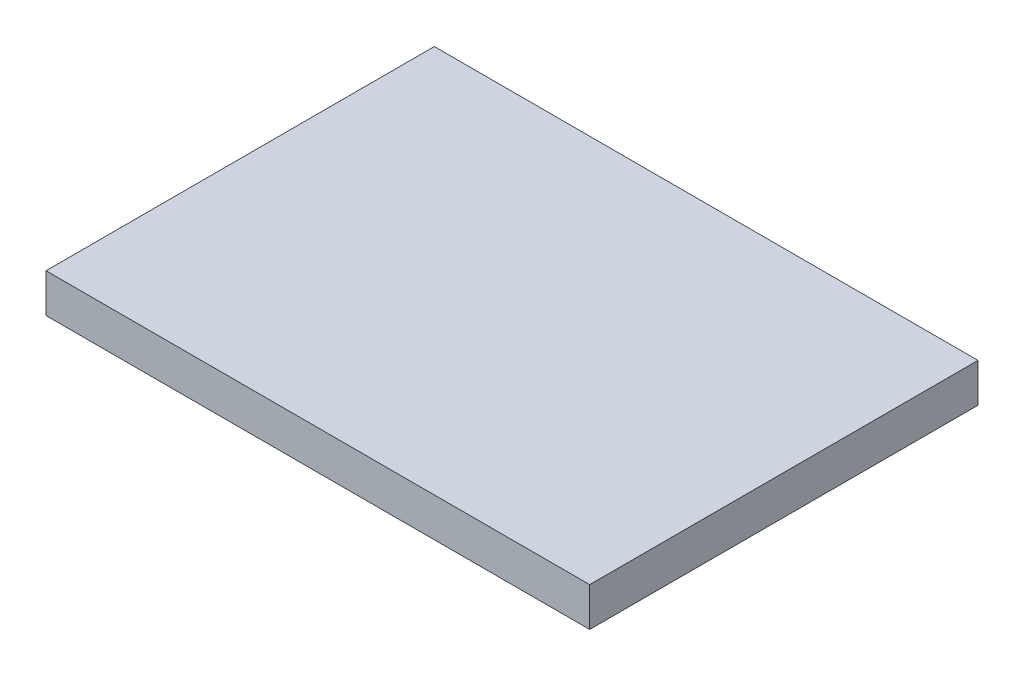
ISO-10303-21;
HEADER;
FILE_DESCRIPTION(('STEP AP214'),'2;1');
FILE_NAME('part.step','',(''),(''),'','','');
FILE_SCHEMA(('AUTOMOTIVE_DESIGN { 1 0 10303 214 1 1 1 1 }'));
ENDSEC;
DATA;
#1=APPLICATION_CONTEXT('core data for automotive mechanical design processes');
#2=APPLICATION_PROTOCOL_DEFINITION('international standard','automotive_design',2000,#1);
#3=PRODUCT_CONTEXT('',#1,'mechanical');
#4=PRODUCT('Part','Part','',(#3));
#5=PRODUCT_RELATED_PRODUCT_CATEGORY('part','',(#4));
#6=PRODUCT_DEFINITION_FORMATION('','',#4);
#7=PRODUCT_DEFINITION_CONTEXT('part definition',#1,'design');
#8=PRODUCT_DEFINITION('design','',#6,#7);
#9=PRODUCT_DEFINITION_SHAPE('','',#8);
#10=(LENGTH_UNIT() NAMED_UNIT(*) SI_UNIT(.MILLI.,.METRE.));
#11=(NAMED_UNIT(*) PLANE_ANGLE_UNIT() SI_UNIT($,.RADIAN.));
#12=(NAMED_UNIT(*) SI_UNIT($,.STERADIAN.) SOLID_ANGLE_UNIT());
#13=UNCERTAINTY_MEASURE_WITH_UNIT(LENGTH_MEASURE(1.E-05),#10,'distance_accuracy_value','');
#14=(GEOMETRIC_REPRESENTATION_CONTEXT(3) GLOBAL_UNCERTAINTY_ASSIGNED_CONTEXT((#13)) GLOBAL_UNIT_ASSIGNED_CONTEXT((#10,
#11,#12)) REPRESENTATION_CONTEXT('',''));
#15=CARTESIAN_POINT('',(0.,0.,0.));
#16=DIRECTION('',(0.,0.,1.));
#17=DIRECTION('',(1.,0.,0.));
#18=AXIS2_PLACEMENT_3D('',#15,#16,#17);
#19=CARTESIAN_POINT('',(88.9,12.7,-63.5));
#20=DIRECTION('',(-1.,0.,0.));
#21=DIRECTION('',(0.,0.,1.));
#22=AXIS2_PLACEMENT_3D('',#19,#20,#21);
#23=PLANE('',#22);
#24=DIRECTION('',(0.,0.,-1.));
#25=VECTOR('',#24,1.);
#26=CARTESIAN_POINT('',(88.9,0.,-63.5));
#27=LINE('',#26,#25);
#28=CARTESIAN_POINT('',(88.9,0.,63.5));
#29=VERTEX_POINT('',#28);
#30=CARTESIAN_POINT('',(88.9,0.,-63.5));
#31=VERTEX_POINT('',#30);
#32=EDGE_CURVE('E96',#29,#31,#27,.T.);
#33=ORIENTED_EDGE('',*,*,#32,.T.);
#34=DIRECTION('',(0.,-1.,0.));
#35=VECTOR('',#34,1.);
#36=CARTESIAN_POINT('',(88.9,12.7,-63.5));
#37=LINE('',#36,#35);
#38=CARTESIAN_POINT('',(88.9,12.7,-63.5));
#39=VERTEX_POINT('',#38);
#40=EDGE_CURVE('E11',#39,#31,#37,.T.);
#41=ORIENTED_EDGE('',*,*,#40,.F.);
#42=DIRECTION('',(0.,0.,-1.));
#43=VECTOR('',#42,1.);
#44=CARTESIAN_POINT('',(88.9,12.7,-63.5));
#45=LINE('',#44,#43);
#46=CARTESIAN_POINT('',(88.9,12.7,63.5));
#47=VERTEX_POINT('',#46);
#48=EDGE_CURVE('E84',#47,#39,#45,.T.);
#49=ORIENTED_EDGE('',*,*,#48,.F.);
#50=DIRECTION('',(0.,-1.,0.));
#51=VECTOR('',#50,1.);
#52=CARTESIAN_POINT('',(88.9,12.7,63.5));
#53=LINE('',#52,#51);
#54=EDGE_CURVE('E92',#47,#29,#53,.T.);
#55=ORIENTED_EDGE('',*,*,#54,.T.);
#56=EDGE_LOOP('',(#33,#41,#49,#55));
#57=FACE_BOUND('',#56,.T.);
#58=ADVANCED_FACE('F33',(#57),#23,.F.);
#59=CARTESIAN_POINT('',(-88.9,12.7,-63.5));
#60=DIRECTION('',(0.,0.,1.));
#61=DIRECTION('',(1.,0.,0.));
#62=AXIS2_PLACEMENT_3D('',#59,#60,#61);
#63=PLANE('',#62);
#64=DIRECTION('',(-1.,0.,0.));
#65=VECTOR('',#64,1.);
#66=CARTESIAN_POINT('',(-88.9,0.,-63.5));
#67=LINE('',#66,#65);
#68=CARTESIAN_POINT('',(-88.9,0.,-63.5));
#69=VERTEX_POINT('',#68);
#70=EDGE_CURVE('E88',#31,#69,#67,.T.);
#71=ORIENTED_EDGE('',*,*,#70,.T.);
#72=DIRECTION('',(0.,-1.,0.));
#73=VECTOR('',#72,1.);
#74=CARTESIAN_POINT('',(-88.9,12.7,-63.5));
#75=LINE('',#74,#73);
#76=CARTESIAN_POINT('',(-88.9,12.7,-63.5));
#77=VERTEX_POINT('',#76);
#78=EDGE_CURVE('E41',#77,#69,#75,.T.);
#79=ORIENTED_EDGE('',*,*,#78,.F.);
#80=DIRECTION('',(-1.,0.,0.));
#81=VECTOR('',#80,1.);
#82=CARTESIAN_POINT('',(-88.9,12.7,-63.5));
#83=LINE('',#82,#81);
#84=EDGE_CURVE('E79',#39,#77,#83,.T.);
#85=ORIENTED_EDGE('',*,*,#84,.F.);
#86=ORIENTED_EDGE('',*,*,#40,.T.);
#87=EDGE_LOOP('',(#71,#79,#85,#86));
#88=FACE_BOUND('',#87,.T.);
#89=ADVANCED_FACE('F87',(#88),#63,.F.);
#90=CARTESIAN_POINT('',(-88.9,12.7,-63.5));
#91=DIRECTION('',(1.,0.,0.));
#92=DIRECTION('',(0.,0.,-1.));
#93=AXIS2_PLACEMENT_3D('',#90,#91,#92);
#94=PLANE('',#93);
#95=DIRECTION('',(0.,0.,1.));
#96=VECTOR('',#95,1.);
#97=CARTESIAN_POINT('',(-88.9,0.,-63.5));
#98=LINE('',#97,#96);
#99=CARTESIAN_POINT('',(-88.9,0.,63.5));
#100=VERTEX_POINT('',#99);
#101=EDGE_CURVE('E66',#69,#100,#98,.T.);
#102=ORIENTED_EDGE('',*,*,#101,.T.);
#103=DIRECTION('',(0.,-1.,0.));
#104=VECTOR('',#103,1.);
#105=CARTESIAN_POINT('',(-88.9,12.7,63.5));
#106=LINE('',#105,#104);
#107=CARTESIAN_POINT('',(-88.9,12.7,63.5));
#108=VERTEX_POINT('',#107);
#109=EDGE_CURVE('E89',#108,#100,#106,.T.);
#110=ORIENTED_EDGE('',*,*,#109,.F.);
#111=DIRECTION('',(0.,0.,1.));
#112=VECTOR('',#111,1.);
#113=CARTESIAN_POINT('',(-88.9,12.7,-63.5));
#114=LINE('',#113,#112);
#115=EDGE_CURVE('E82',#77,#108,#114,.T.);
#116=ORIENTED_EDGE('',*,*,#115,.F.);
#117=ORIENTED_EDGE('',*,*,#78,.T.);
#118=EDGE_LOOP('',(#102,#110,#116,#117));
#119=FACE_BOUND('',#118,.T.);
#120=ADVANCED_FACE('F90',(#119),#94,.F.);
#121=CARTESIAN_POINT('',(-88.9,12.7,63.5));
#122=DIRECTION('',(0.,0.,-1.));
#123=DIRECTION('',(-1.,0.,0.));
#124=AXIS2_PLACEMENT_3D('',#121,#122,#123);
#125=PLANE('',#124);
#126=DIRECTION('',(1.,0.,0.));
#127=VECTOR('',#126,1.);
#128=CARTESIAN_POINT('',(-88.9,0.,63.5));
#129=LINE('',#128,#127);
#130=EDGE_CURVE('E72',#100,#29,#129,.T.);
#131=ORIENTED_EDGE('',*,*,#130,.T.);
#132=ORIENTED_EDGE('',*,*,#54,.F.);
#133=DIRECTION('',(1.,0.,0.));
#134=VECTOR('',#133,1.);
#135=CARTESIAN_POINT('',(-88.9,12.7,63.5));
#136=LINE('',#135,#134);
#137=EDGE_CURVE('E49',#108,#47,#136,.T.);
#138=ORIENTED_EDGE('',*,*,#137,.F.);
#139=ORIENTED_EDGE('',*,*,#109,.T.);
#140=EDGE_LOOP('',(#131,#132,#138,#139));
#141=FACE_BOUND('',#140,.T.);
#142=ADVANCED_FACE('F103',(#141),#125,.F.);
#143=CARTESIAN_POINT('',(0.,12.7,0.));
#144=DIRECTION('',(0.,1.,0.));
#145=DIRECTION('',(0.,0.,1.));
#146=AXIS2_PLACEMENT_3D('',#143,#144,#145);
#147=PLANE('',#146);
#148=ORIENTED_EDGE('',*,*,#48,.T.);
#149=ORIENTED_EDGE('',*,*,#84,.T.);
#150=ORIENTED_EDGE('',*,*,#115,.T.);
#151=ORIENTED_EDGE('',*,*,#137,.T.);
#152=EDGE_LOOP('',(#148,#149,#150,#151));
#153=FACE_BOUND('',#152,.T.);
#154=ADVANCED_FACE('F80',(#153),#147,.T.);
#155=CARTESIAN_POINT('',(0.,0.,0.));
#156=DIRECTION('',(0.,1.,0.));
#157=DIRECTION('',(0.,0.,1.));
#158=AXIS2_PLACEMENT_3D('',#155,#156,#157);
#159=PLANE('',#158);
#160=ORIENTED_EDGE('',*,*,#32,.F.);
#161=ORIENTED_EDGE('',*,*,#130,.F.);
#162=ORIENTED_EDGE('',*,*,#101,.F.);
#163=ORIENTED_EDGE('',*,*,#70,.F.);
#164=EDGE_LOOP('',(#160,#161,#162,#163));
#165=FACE_BOUND('',#164,.T.);
#166=ADVANCED_FACE('F106',(#165),#159,.F.);
#167=CLOSED_SHELL('',(#58,#89,#120,#142,#154,#166));
#168=MANIFOLD_SOLID_BREP('B2',#167);
#169=ADVANCED_BREP_SHAPE_REPRESENTATION('',(#18,#168),#14);
#170=SHAPE_DEFINITION_REPRESENTATION(#9,#169);
ENDSEC;
END-ISO-10303-21;
